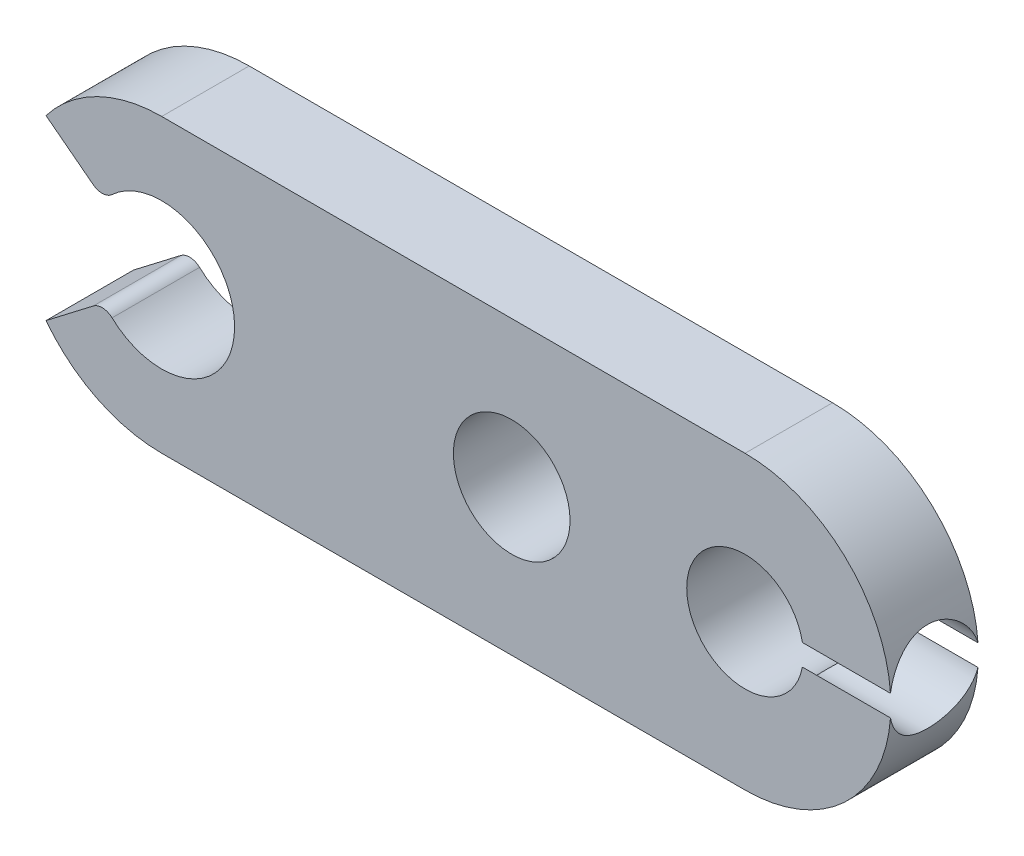
ISO-10303-21;
HEADER;
FILE_DESCRIPTION(('STEP AP214'),'2;1');
FILE_NAME('part.step','',(''),(''),'','','');
FILE_SCHEMA(('AUTOMOTIVE_DESIGN { 1 0 10303 214 1 1 1 1 }'));
ENDSEC;
DATA;
#1=APPLICATION_CONTEXT('core data for automotive mechanical design processes');
#2=APPLICATION_PROTOCOL_DEFINITION('international standard','automotive_design',2000,#1);
#3=PRODUCT_CONTEXT('',#1,'mechanical');
#4=PRODUCT('Part','Part','',(#3));
#5=PRODUCT_RELATED_PRODUCT_CATEGORY('part','',(#4));
#6=PRODUCT_DEFINITION_FORMATION('','',#4);
#7=PRODUCT_DEFINITION_CONTEXT('part definition',#1,'design');
#8=PRODUCT_DEFINITION('design','',#6,#7);
#9=PRODUCT_DEFINITION_SHAPE('','',#8);
#10=(LENGTH_UNIT() NAMED_UNIT(*) SI_UNIT(.MILLI.,.METRE.));
#11=(NAMED_UNIT(*) PLANE_ANGLE_UNIT() SI_UNIT($,.RADIAN.));
#12=(NAMED_UNIT(*) SI_UNIT($,.STERADIAN.) SOLID_ANGLE_UNIT());
#13=UNCERTAINTY_MEASURE_WITH_UNIT(LENGTH_MEASURE(1.E-05),#10,'distance_accuracy_value','');
#14=(GEOMETRIC_REPRESENTATION_CONTEXT(3) GLOBAL_UNCERTAINTY_ASSIGNED_CONTEXT((#13)) GLOBAL_UNIT_ASSIGNED_CONTEXT((#10,
#11,#12)) REPRESENTATION_CONTEXT('',''));
#15=CARTESIAN_POINT('',(0.,0.,0.));
#16=DIRECTION('',(0.,0.,1.));
#17=DIRECTION('',(1.,0.,0.));
#18=AXIS2_PLACEMENT_3D('',#15,#16,#17);
#19=CARTESIAN_POINT('',(0.,0.,3.));
#20=DIRECTION('',(0.,0.,-1.));
#21=DIRECTION('',(-1.,0.,0.));
#22=AXIS2_PLACEMENT_3D('',#19,#20,#21);
#23=CYLINDRICAL_SURFACE('',#22,5.);
#24=CARTESIAN_POINT('',(0.,0.,2.));
#25=DIRECTION('',(0.,0.,-1.));
#26=DIRECTION('',(-1.,0.,0.));
#27=AXIS2_PLACEMENT_3D('',#24,#25,#26);
#28=CIRCLE('',#27,5.);
#29=CARTESIAN_POINT('',(0.,-4.99999999999545,2.));
#30=VERTEX_POINT('',#29);
#31=CARTESIAN_POINT('',(-2.9999999999859,-4.0000000000191,2.));
#32=VERTEX_POINT('',#31);
#33=EDGE_CURVE('E207',#30,#32,#28,.T.);
#34=ORIENTED_EDGE('',*,*,#33,.F.);
#35=DIRECTION('',(0.,0.,-1.));
#36=VECTOR('',#35,1.);
#37=CARTESIAN_POINT('',(0.,-5.,3.));
#38=LINE('',#37,#36);
#39=CARTESIAN_POINT('',(0.,-5.,3.));
#40=VERTEX_POINT('',#39);
#41=EDGE_CURVE('E341',#40,#30,#38,.T.);
#42=ORIENTED_EDGE('',*,*,#41,.F.);
#43=CARTESIAN_POINT('',(0.,0.,3.));
#44=DIRECTION('',(0.,0.,1.));
#45=DIRECTION('',(-1.,0.,0.));
#46=AXIS2_PLACEMENT_3D('',#43,#44,#45);
#47=CIRCLE('',#46,5.);
#48=CARTESIAN_POINT('',(-3.96676670145618,-3.04380714504359,3.));
#49=VERTEX_POINT('',#48);
#50=EDGE_CURVE('E298',#49,#40,#47,.T.);
#51=ORIENTED_EDGE('',*,*,#50,.F.);
#52=DIRECTION('',(0.,0.,-1.));
#53=VECTOR('',#52,1.);
#54=CARTESIAN_POINT('',(-3.96676670145618,-3.04380714504359,3.));
#55=LINE('',#54,#53);
#56=CARTESIAN_POINT('',(-3.96676670145618,-3.04380714504359,0.));
#57=VERTEX_POINT('',#56);
#58=EDGE_CURVE('E344',#49,#57,#55,.T.);
#59=ORIENTED_EDGE('',*,*,#58,.T.);
#60=CARTESIAN_POINT('',(0.,0.,0.));
#61=DIRECTION('',(0.,0.,1.));
#62=DIRECTION('',(-1.,0.,0.));
#63=AXIS2_PLACEMENT_3D('',#60,#61,#62);
#64=CIRCLE('',#63,5.);
#65=CARTESIAN_POINT('',(0.,-5.,0.));
#66=VERTEX_POINT('',#65);
#67=EDGE_CURVE('E320',#57,#66,#64,.T.);
#68=ORIENTED_EDGE('',*,*,#67,.T.);
#69=CARTESIAN_POINT('',(0.,-4.99999999999545,1.));
#70=VERTEX_POINT('',#69);
#71=EDGE_CURVE('E340',#70,#66,#38,.T.);
#72=ORIENTED_EDGE('',*,*,#71,.F.);
#73=CARTESIAN_POINT('',(0.,0.,1.));
#74=DIRECTION('',(0.,0.,-1.));
#75=DIRECTION('',(-1.,0.,0.));
#76=AXIS2_PLACEMENT_3D('',#73,#74,#75);
#77=CIRCLE('',#76,5.);
#78=CARTESIAN_POINT('',(-2.9999999999859,-4.0000000000191,1.));
#79=VERTEX_POINT('',#78);
#80=EDGE_CURVE('E225',#70,#79,#77,.T.);
#81=ORIENTED_EDGE('',*,*,#80,.T.);
#82=DIRECTION('',(0.,0.,-1.));
#83=VECTOR('',#82,1.);
#84=CARTESIAN_POINT('',(-2.9999999999859,-4.0000000000191,2.));
#85=LINE('',#84,#83);
#86=EDGE_CURVE('E223',#32,#79,#85,.T.);
#87=ORIENTED_EDGE('',*,*,#86,.F.);
#88=EDGE_LOOP('',(#34,#42,#51,#59,#68,#72,#81,#87));
#89=FACE_BOUND('',#88,.T.);
#90=ADVANCED_FACE('F41',(#89),#23,.T.);
#91=CARTESIAN_POINT('',(20.,-5.,3.));
#92=DIRECTION('',(0.,1.,0.));
#93=DIRECTION('',(-1.,0.,0.));
#94=AXIS2_PLACEMENT_3D('',#91,#92,#93);
#95=PLANE('',#94);
#96=DIRECTION('',(-1.,0.,0.));
#97=VECTOR('',#96,1.);
#98=CARTESIAN_POINT('',(400010.516616649,-4.99999999999545,2.));
#99=LINE('',#98,#97);
#100=CARTESIAN_POINT('',(19.9999999999818,-4.99999999999545,2.));
#101=VERTEX_POINT('',#100);
#102=EDGE_CURVE('E203',#101,#30,#99,.T.);
#103=ORIENTED_EDGE('',*,*,#102,.F.);
#104=DIRECTION('',(0.,0.,-1.));
#105=VECTOR('',#104,1.);
#106=CARTESIAN_POINT('',(20.,-5.,3.));
#107=LINE('',#106,#105);
#108=CARTESIAN_POINT('',(20.,-5.,3.));
#109=VERTEX_POINT('',#108);
#110=EDGE_CURVE('E337',#109,#101,#107,.T.);
#111=ORIENTED_EDGE('',*,*,#110,.F.);
#112=DIRECTION('',(1.,0.,0.));
#113=VECTOR('',#112,1.);
#114=CARTESIAN_POINT('',(20.,-5.,3.));
#115=LINE('',#114,#113);
#116=EDGE_CURVE('E300',#40,#109,#115,.T.);
#117=ORIENTED_EDGE('',*,*,#116,.F.);
#118=ORIENTED_EDGE('',*,*,#41,.T.);
#119=EDGE_LOOP('',(#103,#111,#117,#118));
#120=FACE_BOUND('',#119,.T.);
#121=ADVANCED_FACE('F425',(#120),#95,.F.);
#122=CARTESIAN_POINT('',(20.,0.,3.));
#123=DIRECTION('',(0.,0.,-1.));
#124=DIRECTION('',(-1.,0.,0.));
#125=AXIS2_PLACEMENT_3D('',#122,#123,#124);
#126=CYLINDRICAL_SURFACE('',#125,5.);
#127=CARTESIAN_POINT('',(19.9999999999999,0.,2.));
#128=DIRECTION('',(0.,0.,-1.));
#129=DIRECTION('',(-1.,0.,0.));
#130=AXIS2_PLACEMENT_3D('',#127,#128,#129);
#131=CIRCLE('',#130,5.00000000000007);
#132=CARTESIAN_POINT('',(23.404072372021,-3.66227952046857,2.));
#133=VERTEX_POINT('',#132);
#134=EDGE_CURVE('E213',#133,#101,#131,.T.);
#135=ORIENTED_EDGE('',*,*,#134,.F.);
#136=DIRECTION('',(0.,0.,-1.));
#137=VECTOR('',#136,1.);
#138=CARTESIAN_POINT('',(23.404072372021,-3.66227952046857,2.));
#139=LINE('',#138,#137);
#140=CARTESIAN_POINT('',(23.404072372021,-3.66227952046857,1.));
#141=VERTEX_POINT('',#140);
#142=EDGE_CURVE('E226',#133,#141,#139,.T.);
#143=ORIENTED_EDGE('',*,*,#142,.T.);
#144=CARTESIAN_POINT('',(19.9999999999999,0.,1.));
#145=DIRECTION('',(0.,0.,-1.));
#146=DIRECTION('',(-1.,0.,0.));
#147=AXIS2_PLACEMENT_3D('',#144,#145,#146);
#148=CIRCLE('',#147,5.00000000000007);
#149=CARTESIAN_POINT('',(20.,-5.,1.));
#150=VERTEX_POINT('',#149);
#151=EDGE_CURVE('E209',#141,#150,#148,.T.);
#152=ORIENTED_EDGE('',*,*,#151,.T.);
#153=CARTESIAN_POINT('',(20.,-5.,0.));
#154=VERTEX_POINT('',#153);
#155=EDGE_CURVE('E336',#150,#154,#107,.T.);
#156=ORIENTED_EDGE('',*,*,#155,.T.);
#157=CARTESIAN_POINT('',(20.,0.,0.));
#158=DIRECTION('',(0.,0.,1.));
#159=DIRECTION('',(-1.,0.,0.));
#160=AXIS2_PLACEMENT_3D('',#157,#158,#159);
#161=CIRCLE('',#160,5.);
#162=CARTESIAN_POINT('',(24.9866658136976,-0.364916514424875,0.));
#163=VERTEX_POINT('',#162);
#164=EDGE_CURVE('E327',#154,#163,#161,.T.);
#165=ORIENTED_EDGE('',*,*,#164,.T.);
#166=CARTESIAN_POINT('',(24.9866658136976,-0.364916514424875,0.));
#167=CARTESIAN_POINT('',(24.9835825094209,-0.407087459470647,0.0102589257328632));
#168=CARTESIAN_POINT('',(24.9799914832528,-0.448766728966271,0.0222835161335183));
#169=CARTESIAN_POINT('',(24.9719075893307,-0.530878539503926,0.0497562045243458));
#170=CARTESIAN_POINT('',(24.9674149785577,-0.571311432024092,0.0652033271118023));
#171=CARTESIAN_POINT('',(24.9527787968857,-0.690163480971913,0.116433234220957));
#172=CARTESIAN_POINT('',(24.9414587060645,-0.766370210096216,0.157162061922017));
#173=CARTESIAN_POINT('',(24.9169189509259,-0.910647962347859,0.250490298007002));
#174=CARTESIAN_POINT('',(24.9037003816804,-0.978723634415758,0.303082873107988));
#175=CARTESIAN_POINT('',(24.8767519710575,-1.10520337968082,0.418780948143433));
#176=CARTESIAN_POINT('',(24.8630219315912,-1.16360365694726,0.481890554820878));
#177=CARTESIAN_POINT('',(24.83622954348,-1.27043059967941,0.618599684623371));
#178=CARTESIAN_POINT('',(24.8231896421701,-1.31859866287736,0.692406079591642));
#179=CARTESIAN_POINT('',(24.7996654616523,-1.40181668200409,0.847458103907504));
#180=CARTESIAN_POINT('',(24.7891808207944,-1.43686849467348,0.928702678275806));
#181=CARTESIAN_POINT('',(24.7722368080486,-1.49217451138823,1.0948928025855));
#182=CARTESIAN_POINT('',(24.7657099512102,-1.51267787997583,1.17974825002846));
#183=CARTESIAN_POINT('',(24.7572457823751,-1.53909440696019,1.35191195587471));
#184=CARTESIAN_POINT('',(24.7553068039853,-1.54501286286999,1.43921931204171));
#185=CARTESIAN_POINT('',(24.7562507215651,-1.54210130532529,1.60973459149127));
#186=CARTESIAN_POINT('',(24.7589270465333,-1.53390314535245,1.6929552647333));
#187=CARTESIAN_POINT('',(24.7683774481442,-1.50426556228149,1.85676025635423));
#188=CARTESIAN_POINT('',(24.775151813276,-1.48282520697216,1.93734438870792));
#189=CARTESIAN_POINT('',(24.7920033559885,-1.42742254234262,2.09372994909098));
#190=CARTESIAN_POINT('',(24.8020816368126,-1.39345604982128,2.16952976944674));
#191=CARTESIAN_POINT('',(24.8244250067065,-1.31400952519945,2.3144804771424));
#192=CARTESIAN_POINT('',(24.8366905885175,-1.26852689784556,2.38362986089972));
#193=CARTESIAN_POINT('',(24.8626891778709,-1.16499660457468,2.51653654117496));
#194=CARTESIAN_POINT('',(24.876462876715,-1.10648695911377,2.57992648886016));
#195=CARTESIAN_POINT('',(24.9035069250958,-0.979703517633687,2.69613711836809));
#196=CARTESIAN_POINT('',(24.9167773404027,-0.911431003049906,2.74895918510936));
#197=CARTESIAN_POINT('',(24.9413860769349,-0.766846121963175,2.84257360399596));
#198=CARTESIAN_POINT('',(24.9527271966569,-0.690545664965429,2.88338344410214));
#199=CARTESIAN_POINT('',(24.9673881795134,-0.571547496128998,2.93470421039402));
#200=CARTESIAN_POINT('',(24.9718875783464,-0.531069559813545,2.950175383051));
#201=CARTESIAN_POINT('',(24.9799830671231,-0.448864447542183,2.97768827337947));
#202=CARTESIAN_POINT('',(24.9835789002845,-0.407136920230079,2.98972901629514));
#203=CARTESIAN_POINT('',(24.9866658136976,-0.364916514424875,3.));
#204=B_SPLINE_CURVE_WITH_KNOTS('',3,(#166,#167,#168,#169,#170,#171,#172,#173,#174,#175,#176,
#177,#178,#179,#180,#181,#182,#183,#184,#185,#186,#187,#188,#189,#190,#191,#192,#193,#194,#195,
#196,#197,#198,#199,#200,#201,#202,#203),.UNSPECIFIED.,.F.,.F.,(4,2,2,2,2,2,2,2,2,2,2,2,2,2,2,2,
2,2,4),(0.,0.13044317055757,0.260849213243291,0.520945334439345,0.780892026228258,
1.04094046217187,1.30693538867901,1.57289264660203,1.83417720753499,2.09536685103203,
2.34516732372902,2.59498538364156,2.84488694790495,3.09484487969436,3.35571855622395,
3.6165580228877,3.87701584742914,4.00757470234654,4.13817061861643),.UNSPECIFIED.);
#205=CARTESIAN_POINT('',(24.9866658136976,-0.364916514424875,3.));
#206=VERTEX_POINT('',#205);
#207=EDGE_CURVE('E238',#163,#206,#204,.T.);
#208=ORIENTED_EDGE('',*,*,#207,.T.);
#209=CARTESIAN_POINT('',(20.,0.,3.));
#210=DIRECTION('',(0.,0.,1.));
#211=DIRECTION('',(-1.,0.,0.));
#212=AXIS2_PLACEMENT_3D('',#209,#210,#211);
#213=CIRCLE('',#212,5.);
#214=EDGE_CURVE('E303',#109,#206,#213,.T.);
#215=ORIENTED_EDGE('',*,*,#214,.F.);
#216=ORIENTED_EDGE('',*,*,#110,.T.);
#217=EDGE_LOOP('',(#135,#143,#152,#156,#165,#208,#215,#216));
#218=FACE_BOUND('',#217,.T.);
#219=ADVANCED_FACE('F248',(#218),#126,.T.);
#220=CARTESIAN_POINT('',(24.9866658136976,0.364916514424875,3.));
#221=VERTEX_POINT('',#220);
#222=CARTESIAN_POINT('',(20.,5.,3.));
#223=VERTEX_POINT('',#222);
#224=EDGE_CURVE('E302',#221,#223,#213,.T.);
#225=ORIENTED_EDGE('',*,*,#224,.F.);
#226=CARTESIAN_POINT('',(24.9866658136976,0.364916514424875,3.));
#227=CARTESIAN_POINT('',(24.9835825094209,0.407087459470647,2.98974107426714));
#228=CARTESIAN_POINT('',(24.9799914832528,0.44876672896627,2.97771648386648));
#229=CARTESIAN_POINT('',(24.9719075893307,0.530878539503926,2.95024379547565));
#230=CARTESIAN_POINT('',(24.9674149785577,0.571311432024092,2.9347966728882));
#231=CARTESIAN_POINT('',(24.9527787968857,0.690163480971913,2.88356676577904));
#232=CARTESIAN_POINT('',(24.9414587060645,0.766370210096216,2.84283793807798));
#233=CARTESIAN_POINT('',(24.9169189509259,0.910647962347859,2.749509701993));
#234=CARTESIAN_POINT('',(24.9037003816804,0.978723634415758,2.69691712689201));
#235=CARTESIAN_POINT('',(24.8767519710575,1.10520337968082,2.58121905185657));
#236=CARTESIAN_POINT('',(24.8630219315912,1.16360365694726,2.51810944517912));
#237=CARTESIAN_POINT('',(24.83622954348,1.27043059967941,2.38140031537663));
#238=CARTESIAN_POINT('',(24.8231896421701,1.31859866287736,2.30759392040836));
#239=CARTESIAN_POINT('',(24.7996654616523,1.40181668200409,2.1525418960925));
#240=CARTESIAN_POINT('',(24.7891808207944,1.43686849467348,2.07129732172419));
#241=CARTESIAN_POINT('',(24.7722368080486,1.49217451138823,1.9051071974145));
#242=CARTESIAN_POINT('',(24.7657099512102,1.51267787997583,1.82025174997154));
#243=CARTESIAN_POINT('',(24.7572457823751,1.53909440696019,1.64808804412529));
#244=CARTESIAN_POINT('',(24.7553068039853,1.54501286286999,1.56078068795829));
#245=CARTESIAN_POINT('',(24.7562507215651,1.54210130532529,1.39026540850873));
#246=CARTESIAN_POINT('',(24.7589270465333,1.53390314535245,1.3070447352667));
#247=CARTESIAN_POINT('',(24.7683774481442,1.50426556228149,1.14323974364577));
#248=CARTESIAN_POINT('',(24.775151813276,1.48282520697216,1.06265561129208));
#249=CARTESIAN_POINT('',(24.7920033559885,1.42742254234262,0.906270050909023));
#250=CARTESIAN_POINT('',(24.8020816368126,1.39345604982127,0.830470230553263));
#251=CARTESIAN_POINT('',(24.8244250067065,1.31400952519945,0.6855195228576));
#252=CARTESIAN_POINT('',(24.8366905885175,1.26852689784556,0.616370139100277));
#253=CARTESIAN_POINT('',(24.8626891778709,1.16499660457468,0.483463458825042));
#254=CARTESIAN_POINT('',(24.876462876715,1.10648695911377,0.420073511139844));
#255=CARTESIAN_POINT('',(24.9035069250958,0.979703517633687,0.30386288163191));
#256=CARTESIAN_POINT('',(24.9167773404027,0.911431003049906,0.251040814890635));
#257=CARTESIAN_POINT('',(24.9413860769349,0.766846121963175,0.157426396004036));
#258=CARTESIAN_POINT('',(24.9527271966569,0.690545664965429,0.116616555897859));
#259=CARTESIAN_POINT('',(24.9673881795134,0.571547496128999,0.0652957896059853));
#260=CARTESIAN_POINT('',(24.9718875783464,0.531069559813545,0.0498246169490044));
#261=CARTESIAN_POINT('',(24.9799830671231,0.448864447542184,0.0223117266205306));
#262=CARTESIAN_POINT('',(24.9835789002845,0.407136920230079,0.0102709837048634));
#263=CARTESIAN_POINT('',(24.9866658136976,0.364916514424875,0.));
#264=B_SPLINE_CURVE_WITH_KNOTS('',3,(#226,#227,#228,#229,#230,#231,#232,#233,#234,#235,#236,
#237,#238,#239,#240,#241,#242,#243,#244,#245,#246,#247,#248,#249,#250,#251,#252,#253,#254,#255,
#256,#257,#258,#259,#260,#261,#262,#263),.UNSPECIFIED.,.F.,.F.,(4,2,2,2,2,2,2,2,2,2,2,2,2,2,2,2,
2,2,4),(0.,0.13044317055757,0.260849213243291,0.520945334439345,0.780892026228258,
1.04094046217187,1.30693538867901,1.57289264660203,1.83417720753499,2.09536685103203,
2.34516732372902,2.59498538364156,2.84488694790495,3.09484487969436,3.35571855622395,
3.6165580228877,3.87701584742914,4.00757470234654,4.13817061861643),.UNSPECIFIED.);
#265=CARTESIAN_POINT('',(24.9866658136976,0.364916514424875,0.));
#266=VERTEX_POINT('',#265);
#267=EDGE_CURVE('E269',#221,#266,#264,.T.);
#268=ORIENTED_EDGE('',*,*,#267,.T.);
#269=CARTESIAN_POINT('',(20.,5.,0.));
#270=VERTEX_POINT('',#269);
#271=EDGE_CURVE('E326',#266,#270,#161,.T.);
#272=ORIENTED_EDGE('',*,*,#271,.T.);
#273=DIRECTION('',(0.,0.,-1.));
#274=VECTOR('',#273,1.);
#275=CARTESIAN_POINT('',(20.,5.,3.));
#276=LINE('',#275,#274);
#277=EDGE_CURVE('E333',#223,#270,#276,.T.);
#278=ORIENTED_EDGE('',*,*,#277,.F.);
#279=EDGE_LOOP('',(#225,#268,#272,#278));
#280=FACE_BOUND('',#279,.T.);
#281=ADVANCED_FACE('F386',(#280),#126,.T.);
#282=CARTESIAN_POINT('',(0.,0.,3.));
#283=DIRECTION('',(0.,0.,-1.));
#284=DIRECTION('',(-1.,0.,0.));
#285=AXIS2_PLACEMENT_3D('',#282,#283,#284);
#286=CYLINDRICAL_SURFACE('',#285,5.);
#287=CARTESIAN_POINT('',(0.,0.,0.));
#288=DIRECTION('',(0.,0.,1.));
#289=DIRECTION('',(-1.,0.,0.));
#290=AXIS2_PLACEMENT_3D('',#287,#288,#289);
#291=CIRCLE('',#290,5.);
#292=CARTESIAN_POINT('',(0.,5.,0.));
#293=VERTEX_POINT('',#292);
#294=CARTESIAN_POINT('',(-3.96676670145618,3.04380714504359,0.));
#295=VERTEX_POINT('',#294);
#296=EDGE_CURVE('E309',#293,#295,#291,.T.);
#297=ORIENTED_EDGE('',*,*,#296,.T.);
#298=DIRECTION('',(0.,0.,-1.));
#299=VECTOR('',#298,1.);
#300=CARTESIAN_POINT('',(-3.96676670145618,3.04380714504359,3.));
#301=LINE('',#300,#299);
#302=CARTESIAN_POINT('',(-3.96676670145618,3.04380714504359,3.));
#303=VERTEX_POINT('',#302);
#304=EDGE_CURVE('E347',#303,#295,#301,.T.);
#305=ORIENTED_EDGE('',*,*,#304,.F.);
#306=CARTESIAN_POINT('',(0.,0.,3.));
#307=DIRECTION('',(0.,0.,1.));
#308=DIRECTION('',(-1.,0.,0.));
#309=AXIS2_PLACEMENT_3D('',#306,#307,#308);
#310=CIRCLE('',#309,5.);
#311=CARTESIAN_POINT('',(0.,5.,3.));
#312=VERTEX_POINT('',#311);
#313=EDGE_CURVE('E286',#312,#303,#310,.T.);
#314=ORIENTED_EDGE('',*,*,#313,.F.);
#315=DIRECTION('',(0.,0.,-1.));
#316=VECTOR('',#315,1.);
#317=CARTESIAN_POINT('',(0.,5.,3.));
#318=LINE('',#317,#316);
#319=EDGE_CURVE('E308',#312,#293,#318,.T.);
#320=ORIENTED_EDGE('',*,*,#319,.T.);
#321=EDGE_LOOP('',(#297,#305,#314,#320));
#322=FACE_BOUND('',#321,.T.);
#323=ADVANCED_FACE('F395',(#322),#286,.T.);
#324=CARTESIAN_POINT('',(-3.96676670145618,3.04380714504359,3.));
#325=DIRECTION('',(0.608761429008719,0.793353340291236,0.));
#326=DIRECTION('',(-0.793353340291236,0.60876142900872,0.));
#327=AXIS2_PLACEMENT_3D('',#324,#325,#326);
#328=PLANE('',#327);
#329=DIRECTION('',(0.793353340291236,-0.60876142900872,0.));
#330=VECTOR('',#329,1.);
#331=CARTESIAN_POINT('',(-3.96676670145618,3.04380714504359,0.));
#332=LINE('',#331,#330);
#333=CARTESIAN_POINT('',(-2.34677082867577,1.80074059144465,0.));
#334=VERTEX_POINT('',#333);
#335=EDGE_CURVE('E312',#295,#334,#332,.T.);
#336=ORIENTED_EDGE('',*,*,#335,.T.);
#337=DIRECTION('',(0.,0.,-1.));
#338=VECTOR('',#337,1.);
#339=CARTESIAN_POINT('',(-2.34677082867577,1.80074059144465,3.));
#340=LINE('',#339,#338);
#341=CARTESIAN_POINT('',(-2.34677082867577,1.80074059144465,3.));
#342=VERTEX_POINT('',#341);
#343=EDGE_CURVE('E359',#334,#342,#340,.F.);
#344=ORIENTED_EDGE('',*,*,#343,.T.);
#345=DIRECTION('',(0.793353340291236,-0.60876142900872,0.));
#346=VECTOR('',#345,1.);
#347=CARTESIAN_POINT('',(-3.96676670145618,3.04380714504359,3.));
#348=LINE('',#347,#346);
#349=EDGE_CURVE('E289',#303,#342,#348,.T.);
#350=ORIENTED_EDGE('',*,*,#349,.F.);
#351=ORIENTED_EDGE('',*,*,#304,.T.);
#352=EDGE_LOOP('',(#336,#344,#350,#351));
#353=FACE_BOUND('',#352,.T.);
#354=ADVANCED_FACE('F398',(#353),#328,.F.);
#355=CARTESIAN_POINT('',(0.,0.,3.));
#356=DIRECTION('',(0.,0.,-1.));
#357=DIRECTION('',(-1.,0.,0.));
#358=AXIS2_PLACEMENT_3D('',#355,#356,#357);
#359=CYLINDRICAL_SURFACE('',#358,2.5);
#360=CARTESIAN_POINT('',(0.,0.,3.));
#361=DIRECTION('',(0.,0.,-1.));
#362=DIRECTION('',(-1.,0.,0.));
#363=AXIS2_PLACEMENT_3D('',#360,#361,#362);
#364=CIRCLE('',#363,2.5);
#365=CARTESIAN_POINT('',(-1.70199176180951,1.83118105132523,3.));
#366=VERTEX_POINT('',#365);
#367=CARTESIAN_POINT('',(-1.70199176180951,-1.83118105132523,3.));
#368=VERTEX_POINT('',#367);
#369=EDGE_CURVE('E293',#366,#368,#364,.T.);
#370=ORIENTED_EDGE('',*,*,#369,.F.);
#371=DIRECTION('',(0.,0.,-1.));
#372=VECTOR('',#371,1.);
#373=CARTESIAN_POINT('',(-1.70199176180951,1.83118105132523,3.));
#374=LINE('',#373,#372);
#375=CARTESIAN_POINT('',(-1.70199176180951,1.83118105132523,0.));
#376=VERTEX_POINT('',#375);
#377=EDGE_CURVE('E352',#366,#376,#374,.T.);
#378=ORIENTED_EDGE('',*,*,#377,.T.);
#379=CARTESIAN_POINT('',(0.,0.,0.));
#380=DIRECTION('',(0.,0.,-1.));
#381=DIRECTION('',(-1.,0.,0.));
#382=AXIS2_PLACEMENT_3D('',#379,#380,#381);
#383=CIRCLE('',#382,2.5);
#384=CARTESIAN_POINT('',(-1.70199176180951,-1.83118105132523,0.));
#385=VERTEX_POINT('',#384);
#386=EDGE_CURVE('E315',#376,#385,#383,.T.);
#387=ORIENTED_EDGE('',*,*,#386,.T.);
#388=DIRECTION('',(0.,0.,-1.));
#389=VECTOR('',#388,1.);
#390=CARTESIAN_POINT('',(-1.70199176180951,-1.83118105132523,3.));
#391=LINE('',#390,#389);
#392=EDGE_CURVE('E350',#385,#368,#391,.F.);
#393=ORIENTED_EDGE('',*,*,#392,.T.);
#394=EDGE_LOOP('',(#370,#378,#387,#393));
#395=FACE_BOUND('',#394,.T.);
#396=ADVANCED_FACE('F406',(#395),#359,.F.);
#397=CARTESIAN_POINT('',(-1.98338335072809,-1.52190357252179,3.));
#398=DIRECTION('',(0.608761429008719,-0.793353340291236,0.));
#399=DIRECTION('',(0.793353340291236,0.60876142900872,0.));
#400=AXIS2_PLACEMENT_3D('',#397,#398,#399);
#401=PLANE('',#400);
#402=DIRECTION('',(-0.793353340291236,-0.60876142900872,0.));
#403=VECTOR('',#402,1.);
#404=CARTESIAN_POINT('',(-1.98338335072809,-1.52190357252179,3.));
#405=LINE('',#404,#403);
#406=CARTESIAN_POINT('',(-2.34677082867577,-1.80074059144465,3.));
#407=VERTEX_POINT('',#406);
#408=EDGE_CURVE('E296',#407,#49,#405,.T.);
#409=ORIENTED_EDGE('',*,*,#408,.F.);
#410=DIRECTION('',(0.,0.,-1.));
#411=VECTOR('',#410,1.);
#412=CARTESIAN_POINT('',(-2.34677082867577,-1.80074059144465,3.));
#413=LINE('',#412,#411);
#414=CARTESIAN_POINT('',(-2.34677082867577,-1.80074059144465,0.));
#415=VERTEX_POINT('',#414);
#416=EDGE_CURVE('E365',#407,#415,#413,.T.);
#417=ORIENTED_EDGE('',*,*,#416,.T.);
#418=DIRECTION('',(-0.793353340291236,-0.60876142900872,0.));
#419=VECTOR('',#418,1.);
#420=CARTESIAN_POINT('',(-1.98338335072809,-1.52190357252179,0.));
#421=LINE('',#420,#419);
#422=EDGE_CURVE('E318',#415,#57,#421,.T.);
#423=ORIENTED_EDGE('',*,*,#422,.T.);
#424=ORIENTED_EDGE('',*,*,#58,.F.);
#425=EDGE_LOOP('',(#409,#417,#423,#424));
#426=FACE_BOUND('',#425,.T.);
#427=ADVANCED_FACE('F414',(#426),#401,.F.);
#428=ORIENTED_EDGE('',*,*,#155,.F.);
#429=DIRECTION('',(-1.,0.,0.));
#430=VECTOR('',#429,1.);
#431=CARTESIAN_POINT('',(400010.516616649,-4.99999999999545,1.));
#432=LINE('',#431,#430);
#433=EDGE_CURVE('E62',#150,#70,#432,.T.);
#434=ORIENTED_EDGE('',*,*,#433,.T.);
#435=ORIENTED_EDGE('',*,*,#71,.T.);
#436=DIRECTION('',(1.,0.,0.));
#437=VECTOR('',#436,1.);
#438=CARTESIAN_POINT('',(20.,-5.,0.));
#439=LINE('',#438,#437);
#440=EDGE_CURVE('E323',#66,#154,#439,.T.);
#441=ORIENTED_EDGE('',*,*,#440,.T.);
#442=EDGE_LOOP('',(#428,#434,#435,#441));
#443=FACE_BOUND('',#442,.T.);
#444=ADVANCED_FACE('F439',(#443),#95,.F.);
#445=CARTESIAN_POINT('',(0.,5.,3.));
#446=DIRECTION('',(0.,-1.,0.));
#447=DIRECTION('',(1.,0.,0.));
#448=AXIS2_PLACEMENT_3D('',#445,#446,#447);
#449=PLANE('',#448);
#450=DIRECTION('',(-1.,0.,0.));
#451=VECTOR('',#450,1.);
#452=CARTESIAN_POINT('',(0.,5.,0.));
#453=LINE('',#452,#451);
#454=EDGE_CURVE('E290',#270,#293,#453,.T.);
#455=ORIENTED_EDGE('',*,*,#454,.T.);
#456=ORIENTED_EDGE('',*,*,#319,.F.);
#457=DIRECTION('',(-1.,0.,0.));
#458=VECTOR('',#457,1.);
#459=CARTESIAN_POINT('',(0.,5.,3.));
#460=LINE('',#459,#458);
#461=EDGE_CURVE('E306',#223,#312,#460,.T.);
#462=ORIENTED_EDGE('',*,*,#461,.F.);
#463=ORIENTED_EDGE('',*,*,#277,.T.);
#464=EDGE_LOOP('',(#455,#456,#462,#463));
#465=FACE_BOUND('',#464,.T.);
#466=ADVANCED_FACE('F390',(#465),#449,.F.);
#467=CARTESIAN_POINT('',(0.,0.,3.));
#468=DIRECTION('',(0.,0.,-1.));
#469=DIRECTION('',(-1.,0.,0.));
#470=AXIS2_PLACEMENT_3D('',#467,#468,#469);
#471=PLANE('',#470);
#472=CARTESIAN_POINT('',(12.,0.,3.));
#473=DIRECTION('',(0.,0.,1.));
#474=DIRECTION('',(1.,0.,0.));
#475=AXIS2_PLACEMENT_3D('',#472,#473,#474);
#476=CIRCLE('',#475,2.);
#477=CARTESIAN_POINT('',(14.,0.,3.));
#478=VERTEX_POINT('',#477);
#479=EDGE_CURVE('E276',#478,#478,#476,.T.);
#480=ORIENTED_EDGE('',*,*,#479,.F.);
#481=EDGE_LOOP('',(#480));
#482=FACE_BOUND('',#481,.T.);
#483=CARTESIAN_POINT('',(20.,0.,3.));
#484=DIRECTION('',(0.,0.,1.));
#485=DIRECTION('',(1.,0.,0.));
#486=AXIS2_PLACEMENT_3D('',#483,#484,#485);
#487=CIRCLE('',#486,2.);
#488=CARTESIAN_POINT('',(21.9664272011697,0.364916514424875,3.));
#489=VERTEX_POINT('',#488);
#490=CARTESIAN_POINT('',(21.9664272011697,-0.364916514424875,3.));
#491=VERTEX_POINT('',#490);
#492=EDGE_CURVE('E280',#489,#491,#487,.T.);
#493=ORIENTED_EDGE('',*,*,#492,.F.);
#494=DIRECTION('',(1.,0.,0.));
#495=VECTOR('',#494,1.);
#496=CARTESIAN_POINT('',(20.,0.364916514424875,3.));
#497=LINE('',#496,#495);
#498=EDGE_CURVE('E70',#489,#221,#497,.T.);
#499=ORIENTED_EDGE('',*,*,#498,.T.);
#500=ORIENTED_EDGE('',*,*,#224,.T.);
#501=ORIENTED_EDGE('',*,*,#461,.T.);
#502=ORIENTED_EDGE('',*,*,#313,.T.);
#503=ORIENTED_EDGE('',*,*,#349,.T.);
#504=CARTESIAN_POINT('',(-2.04239011417141,2.19741726159027,3.));
#505=DIRECTION('',(0.,0.,-1.));
#506=DIRECTION('',(-1.,0.,0.));
#507=AXIS2_PLACEMENT_3D('',#504,#505,#506);
#508=CIRCLE('',#507,0.5);
#509=EDGE_CURVE('E363',#342,#366,#508,.F.);
#510=ORIENTED_EDGE('',*,*,#509,.T.);
#511=ORIENTED_EDGE('',*,*,#369,.T.);
#512=CARTESIAN_POINT('',(-2.04239011417141,-2.19741726159027,3.));
#513=DIRECTION('',(0.,0.,-1.));
#514=DIRECTION('',(-1.,0.,0.));
#515=AXIS2_PLACEMENT_3D('',#512,#513,#514);
#516=CIRCLE('',#515,0.5);
#517=EDGE_CURVE('E361',#368,#407,#516,.F.);
#518=ORIENTED_EDGE('',*,*,#517,.T.);
#519=ORIENTED_EDGE('',*,*,#408,.T.);
#520=ORIENTED_EDGE('',*,*,#50,.T.);
#521=ORIENTED_EDGE('',*,*,#116,.T.);
#522=ORIENTED_EDGE('',*,*,#214,.T.);
#523=DIRECTION('',(1.,0.,0.));
#524=VECTOR('',#523,1.);
#525=CARTESIAN_POINT('',(20.,-0.364916514424875,3.));
#526=LINE('',#525,#524);
#527=EDGE_CURVE('E235',#206,#491,#526,.F.);
#528=ORIENTED_EDGE('',*,*,#527,.T.);
#529=EDGE_LOOP('',(#493,#499,#500,#501,#502,#503,#510,#511,#518,#519,#520,#521,#522,#528));
#530=FACE_BOUND('',#529,.T.);
#531=ADVANCED_FACE('F383',(#482,#530),#471,.F.);
#532=CARTESIAN_POINT('',(0.,0.,0.));
#533=DIRECTION('',(0.,0.,-1.));
#534=DIRECTION('',(-1.,0.,0.));
#535=AXIS2_PLACEMENT_3D('',#532,#533,#534);
#536=PLANE('',#535);
#537=DIRECTION('',(1.,0.,0.));
#538=VECTOR('',#537,1.);
#539=CARTESIAN_POINT('',(20.,0.364916514424875,0.));
#540=LINE('',#539,#538);
#541=CARTESIAN_POINT('',(21.9664272011697,0.364916514424875,0.));
#542=VERTEX_POINT('',#541);
#543=EDGE_CURVE('E246',#542,#266,#540,.T.);
#544=ORIENTED_EDGE('',*,*,#543,.F.);
#545=CARTESIAN_POINT('',(20.,0.,0.));
#546=DIRECTION('',(0.,0.,-1.));
#547=DIRECTION('',(-1.,0.,0.));
#548=AXIS2_PLACEMENT_3D('',#545,#546,#547);
#549=CIRCLE('',#548,2.);
#550=CARTESIAN_POINT('',(21.9664272011697,-0.364916514424875,0.));
#551=VERTEX_POINT('',#550);
#552=EDGE_CURVE('E285',#551,#542,#549,.T.);
#553=ORIENTED_EDGE('',*,*,#552,.F.);
#554=DIRECTION('',(1.,0.,0.));
#555=VECTOR('',#554,1.);
#556=CARTESIAN_POINT('',(20.,-0.364916514424875,0.));
#557=LINE('',#556,#555);
#558=EDGE_CURVE('E233',#163,#551,#557,.F.);
#559=ORIENTED_EDGE('',*,*,#558,.F.);
#560=ORIENTED_EDGE('',*,*,#164,.F.);
#561=ORIENTED_EDGE('',*,*,#440,.F.);
#562=ORIENTED_EDGE('',*,*,#67,.F.);
#563=ORIENTED_EDGE('',*,*,#422,.F.);
#564=CARTESIAN_POINT('',(-2.04239011417141,-2.19741726159027,0.));
#565=DIRECTION('',(0.,0.,-1.));
#566=DIRECTION('',(-1.,0.,0.));
#567=AXIS2_PLACEMENT_3D('',#564,#565,#566);
#568=CIRCLE('',#567,0.5);
#569=EDGE_CURVE('E355',#415,#385,#568,.T.);
#570=ORIENTED_EDGE('',*,*,#569,.T.);
#571=ORIENTED_EDGE('',*,*,#386,.F.);
#572=CARTESIAN_POINT('',(-2.04239011417141,2.19741726159027,0.));
#573=DIRECTION('',(0.,0.,-1.));
#574=DIRECTION('',(-1.,0.,0.));
#575=AXIS2_PLACEMENT_3D('',#572,#573,#574);
#576=CIRCLE('',#575,0.5);
#577=EDGE_CURVE('E357',#376,#334,#576,.T.);
#578=ORIENTED_EDGE('',*,*,#577,.T.);
#579=ORIENTED_EDGE('',*,*,#335,.F.);
#580=ORIENTED_EDGE('',*,*,#296,.F.);
#581=ORIENTED_EDGE('',*,*,#454,.F.);
#582=ORIENTED_EDGE('',*,*,#271,.F.);
#583=EDGE_LOOP('',(#544,#553,#559,#560,#561,#562,#563,#570,#571,#578,#579,#580,#581,#582));
#584=FACE_BOUND('',#583,.T.);
#585=CARTESIAN_POINT('',(12.,0.,0.));
#586=DIRECTION('',(0.,0.,1.));
#587=DIRECTION('',(1.,0.,0.));
#588=AXIS2_PLACEMENT_3D('',#585,#586,#587);
#589=CIRCLE('',#588,2.);
#590=CARTESIAN_POINT('',(14.,0.,0.));
#591=VERTEX_POINT('',#590);
#592=EDGE_CURVE('E277',#591,#591,#589,.T.);
#593=ORIENTED_EDGE('',*,*,#592,.T.);
#594=EDGE_LOOP('',(#593));
#595=FACE_BOUND('',#594,.T.);
#596=ADVANCED_FACE('F376',(#584,#595),#536,.T.);
#597=CARTESIAN_POINT('',(-2.04239011417141,2.19741726159027,3.));
#598=DIRECTION('',(0.,0.,-1.));
#599=DIRECTION('',(-1.,0.,0.));
#600=AXIS2_PLACEMENT_3D('',#597,#598,#599);
#601=CYLINDRICAL_SURFACE('',#600,0.5);
#602=ORIENTED_EDGE('',*,*,#509,.F.);
#603=ORIENTED_EDGE('',*,*,#343,.F.);
#604=ORIENTED_EDGE('',*,*,#577,.F.);
#605=ORIENTED_EDGE('',*,*,#377,.F.);
#606=EDGE_LOOP('',(#602,#603,#604,#605));
#607=FACE_BOUND('',#606,.T.);
#608=ADVANCED_FACE('F401',(#607),#601,.T.);
#609=CARTESIAN_POINT('',(-2.04239011417141,-2.19741726159027,3.));
#610=DIRECTION('',(0.,0.,-1.));
#611=DIRECTION('',(-1.,0.,0.));
#612=AXIS2_PLACEMENT_3D('',#609,#610,#611);
#613=CYLINDRICAL_SURFACE('',#612,0.5);
#614=ORIENTED_EDGE('',*,*,#517,.F.);
#615=ORIENTED_EDGE('',*,*,#392,.F.);
#616=ORIENTED_EDGE('',*,*,#569,.F.);
#617=ORIENTED_EDGE('',*,*,#416,.F.);
#618=EDGE_LOOP('',(#614,#615,#616,#617));
#619=FACE_BOUND('',#618,.T.);
#620=ADVANCED_FACE('F43',(#619),#613,.T.);
#621=CARTESIAN_POINT('',(20.,0.,-7.));
#622=DIRECTION('',(0.,0.,1.));
#623=DIRECTION('',(1.,0.,0.));
#624=AXIS2_PLACEMENT_3D('',#621,#622,#623);
#625=CYLINDRICAL_SURFACE('',#624,2.);
#626=ORIENTED_EDGE('',*,*,#552,.T.);
#627=CARTESIAN_POINT('',(21.9664272011697,0.364916514424875,0.));
#628=CARTESIAN_POINT('',(21.9587883264413,0.406107065267904,0.0100177488154413));
#629=CARTESIAN_POINT('',(21.9499241131496,0.446629819331682,0.0216763903570576));
#630=CARTESIAN_POINT('',(21.9300088230575,0.526057398189989,0.0480444703619504));
#631=CARTESIAN_POINT('',(21.9189605915951,0.56496424920748,0.0627499406046313));
#632=CARTESIAN_POINT('',(21.8831265887478,0.678278692118969,0.110832200877119));
#633=CARTESIAN_POINT('',(21.8554976724103,0.750064959171066,0.148372309078146));
#634=CARTESIAN_POINT('',(21.7950898502631,0.884930667736566,0.232573375905148));
#635=CARTESIAN_POINT('',(21.762337133269,0.948051477679748,0.279188232557576));
#636=CARTESIAN_POINT('',(21.6937015112114,1.06584944422027,0.380542684088892));
#637=CARTESIAN_POINT('',(21.657807993335,1.12049609593131,0.435310301464739));
#638=CARTESIAN_POINT('',(21.5793729492681,1.22913389007068,0.561676766528488));
#639=CARTESIAN_POINT('',(21.5367086128833,1.2815402566019,0.634562440865997));
#640=CARTESIAN_POINT('',(21.4549624209587,1.37362537234871,0.789762533662742));
#641=CARTESIAN_POINT('',(21.4158740595265,1.41332757731512,0.872059190606243));
#642=CARTESIAN_POINT('',(21.359970665784,1.46676844202156,1.01491909152389));
#643=CARTESIAN_POINT('',(21.3401890014049,1.48471473131142,1.07273174032052));
#644=CARTESIAN_POINT('',(21.3071299117916,1.51390204432257,1.19177268689453));
#645=CARTESIAN_POINT('',(21.2938379642155,1.52515805159372,1.25299301369019));
#646=CARTESIAN_POINT('',(21.2758440521867,1.54025132027787,1.37833124544106));
#647=CARTESIAN_POINT('',(21.2712340369204,1.54400919450612,1.44247287787045));
#648=CARTESIAN_POINT('',(21.2718972401252,1.54346279851349,1.57067787129179));
#649=CARTESIAN_POINT('',(21.277171310981,1.53915783296864,1.63474122505639));
#650=CARTESIAN_POINT('',(21.2952466232585,1.52395694053418,1.75261135429367));
#651=CARTESIAN_POINT('',(21.3070300763054,1.51394736828054,1.80670277947209));
#652=CARTESIAN_POINT('',(21.3357341973442,1.48868431011668,1.9122264655418));
#653=CARTESIAN_POINT('',(21.3526599708548,1.47342561064437,1.96365602395259));
#654=CARTESIAN_POINT('',(21.4024264766312,1.42653501140724,2.09659130925614));
#655=CARTESIAN_POINT('',(21.4383839822327,1.39075185952925,2.17546109430602));
#656=CARTESIAN_POINT('',(21.5143117344765,1.3076899390968,2.32489494487935));
#657=CARTESIAN_POINT('',(21.5542940621062,1.26037591655357,2.39543253480296));
#658=CARTESIAN_POINT('',(21.6355869981853,1.15305818015247,2.53018417621448));
#659=CARTESIAN_POINT('',(21.6768961762853,1.0926751980493,2.59409872600945));
#660=CARTESIAN_POINT('',(21.755757848189,0.960830684242825,2.71149664224742));
#661=CARTESIAN_POINT('',(21.7933246158961,0.889414122940207,2.76502044479176));
#662=CARTESIAN_POINT('',(21.8572421606741,0.745663855458487,2.85400864633851));
#663=CARTESIAN_POINT('',(21.8844114747653,0.67459873904644,2.89090335913902));
#664=CARTESIAN_POINT('',(21.9196657848433,0.562529261302409,2.9381902166413));
#665=CARTESIAN_POINT('',(21.9305358359912,0.52408084901291,2.95265520501132));
#666=CARTESIAN_POINT('',(21.9501466530264,0.445611593497059,2.97861633220669));
#667=CARTESIAN_POINT('',(21.9588845539245,0.405588717542319,2.99010847762917));
#668=CARTESIAN_POINT('',(21.9664272011697,0.364916514424875,3.));
#669=B_SPLINE_CURVE_WITH_KNOTS('',3,(#627,#628,#629,#630,#631,#632,#633,#634,#635,#636,#637,
#638,#639,#640,#641,#642,#643,#644,#645,#646,#647,#648,#649,#650,#651,#652,#653,#654,#655,#656,
#657,#658,#659,#660,#661,#662,#663,#664,#665,#666,#667,#668),.UNSPECIFIED.,.F.,.F.,(4,2,2,2,2,2,
2,2,2,2,2,2,2,2,2,2,2,2,2,2,4),(0.,0.129101286494827,0.258035475374381,0.513470253998129,
0.767639717253799,1.0227038894613,1.31970137090995,1.61614729755723,1.8065957280898,
1.99661600742213,2.18863768962032,2.38067593216555,2.5488291751373,2.71714991656343,
2.9969329388767,3.27758233194512,3.56784838155785,3.85696114905458,4.10935303536386,
4.23666518576158,4.36414747604786),.UNSPECIFIED.);
#670=EDGE_CURVE('E11',#542,#489,#669,.T.);
#671=ORIENTED_EDGE('',*,*,#670,.T.);
#672=ORIENTED_EDGE('',*,*,#492,.T.);
#673=CARTESIAN_POINT('',(21.9664272011697,-0.364916514424875,3.));
#674=CARTESIAN_POINT('',(21.9587883264413,-0.406107065267904,2.98998225118456));
#675=CARTESIAN_POINT('',(21.9499241131496,-0.446629819331682,2.97832360964294));
#676=CARTESIAN_POINT('',(21.9300088230575,-0.526057398189989,2.95195552963805));
#677=CARTESIAN_POINT('',(21.9189605915951,-0.56496424920748,2.93725005939537));
#678=CARTESIAN_POINT('',(21.8831265887478,-0.678278692118969,2.88916779912288));
#679=CARTESIAN_POINT('',(21.8554976724103,-0.750064959171066,2.85162769092185));
#680=CARTESIAN_POINT('',(21.7950898502631,-0.884930667736566,2.76742662409485));
#681=CARTESIAN_POINT('',(21.762337133269,-0.948051477679748,2.72081176744242));
#682=CARTESIAN_POINT('',(21.6937015112114,-1.06584944422027,2.61945731591111));
#683=CARTESIAN_POINT('',(21.657807993335,-1.12049609593131,2.56468969853526));
#684=CARTESIAN_POINT('',(21.5793729492681,-1.22913389007068,2.43832323347151));
#685=CARTESIAN_POINT('',(21.5367086128833,-1.2815402566019,2.365437559134));
#686=CARTESIAN_POINT('',(21.4549624209587,-1.37362537234871,2.21023746633726));
#687=CARTESIAN_POINT('',(21.4158740595265,-1.41332757731512,2.12794080939376));
#688=CARTESIAN_POINT('',(21.359970665784,-1.46676844202156,1.98508090847611));
#689=CARTESIAN_POINT('',(21.3401890014049,-1.48471473131142,1.92726825967948));
#690=CARTESIAN_POINT('',(21.3071299117916,-1.51390204432257,1.80822731310547));
#691=CARTESIAN_POINT('',(21.2938379642155,-1.52515805159372,1.74700698630981));
#692=CARTESIAN_POINT('',(21.2758440521867,-1.54025132027787,1.62166875455895));
#693=CARTESIAN_POINT('',(21.2712340369204,-1.54400919450612,1.55752712212956));
#694=CARTESIAN_POINT('',(21.2718972401252,-1.54346279851349,1.42932212870821));
#695=CARTESIAN_POINT('',(21.277171310981,-1.53915783296864,1.36525877494361));
#696=CARTESIAN_POINT('',(21.2952466232585,-1.52395694053418,1.24738864570633));
#697=CARTESIAN_POINT('',(21.3070300763054,-1.51394736828054,1.19329722052791));
#698=CARTESIAN_POINT('',(21.3357341973442,-1.48868431011668,1.08777353445821));
#699=CARTESIAN_POINT('',(21.3526599708548,-1.47342561064437,1.03634397604741));
#700=CARTESIAN_POINT('',(21.4024264766312,-1.42653501140725,0.903408690743866));
#701=CARTESIAN_POINT('',(21.4383839822327,-1.39075185952926,0.824538905693986));
#702=CARTESIAN_POINT('',(21.5143117344765,-1.3076899390968,0.675105055120656));
#703=CARTESIAN_POINT('',(21.5542940621062,-1.26037591655357,0.604567465197046));
#704=CARTESIAN_POINT('',(21.6355869981853,-1.15305818015247,0.469815823785527));
#705=CARTESIAN_POINT('',(21.6768961762853,-1.0926751980493,0.405901273990556));
#706=CARTESIAN_POINT('',(21.755757848189,-0.960830684242829,0.288503357752586));
#707=CARTESIAN_POINT('',(21.7933246158961,-0.889414122940213,0.234979555208246));
#708=CARTESIAN_POINT('',(21.8572421606741,-0.745663855458494,0.145991353661494));
#709=CARTESIAN_POINT('',(21.8844114747653,-0.674598739046445,0.109096640860981));
#710=CARTESIAN_POINT('',(21.9196657848433,-0.562529261302412,0.0618097833587065));
#711=CARTESIAN_POINT('',(21.9305358359912,-0.524080849012913,0.0473447949886778));
#712=CARTESIAN_POINT('',(21.9501466530264,-0.44561159349706,0.0213836677933094));
#713=CARTESIAN_POINT('',(21.9588845539245,-0.40558871754232,0.00989152237082805));
#714=CARTESIAN_POINT('',(21.9664272011697,-0.364916514424875,0.));
#715=B_SPLINE_CURVE_WITH_KNOTS('',3,(#673,#674,#675,#676,#677,#678,#679,#680,#681,#682,#683,
#684,#685,#686,#687,#688,#689,#690,#691,#692,#693,#694,#695,#696,#697,#698,#699,#700,#701,#702,
#703,#704,#705,#706,#707,#708,#709,#710,#711,#712,#713,#714),.UNSPECIFIED.,.F.,.F.,(4,2,2,2,2,2,
2,2,2,2,2,2,2,2,2,2,2,2,2,2,4),(0.,0.129101286494827,0.258035475374381,0.513470253998129,
0.767639717253799,1.0227038894613,1.31970137090995,1.61614729755723,1.8065957280898,
1.99661600742213,2.18863768962031,2.38067593216555,2.5488291751373,2.71714991656342,
2.9969329388767,3.27758233194511,3.56784838155784,3.85696114905457,4.10935303536386,
4.23666518576158,4.36414747604786),.UNSPECIFIED.);
#716=EDGE_CURVE('E55',#491,#551,#715,.T.);
#717=ORIENTED_EDGE('',*,*,#716,.T.);
#718=EDGE_LOOP('',(#626,#671,#672,#717));
#719=FACE_BOUND('',#718,.T.);
#720=ADVANCED_FACE('F371',(#719),#625,.F.);
#721=CARTESIAN_POINT('',(12.,0.,0.));
#722=DIRECTION('',(0.,0.,1.));
#723=DIRECTION('',(1.,0.,0.));
#724=AXIS2_PLACEMENT_3D('',#721,#722,#723);
#725=CYLINDRICAL_SURFACE('',#724,2.);
#726=ORIENTED_EDGE('',*,*,#592,.F.);
#727=EDGE_LOOP('',(#726));
#728=FACE_BOUND('',#727,.T.);
#729=ORIENTED_EDGE('',*,*,#479,.T.);
#730=EDGE_LOOP('',(#729));
#731=FACE_BOUND('',#730,.T.);
#732=ADVANCED_FACE('F259',(#728,#731),#725,.F.);
#733=CARTESIAN_POINT('',(20.,0.,1.5));
#734=DIRECTION('',(1.,0.,0.));
#735=DIRECTION('',(0.,0.,-1.));
#736=AXIS2_PLACEMENT_3D('',#733,#734,#735);
#737=CYLINDRICAL_SURFACE('',#736,1.54375);
#738=ORIENTED_EDGE('',*,*,#558,.T.);
#739=ORIENTED_EDGE('',*,*,#716,.F.);
#740=ORIENTED_EDGE('',*,*,#527,.F.);
#741=ORIENTED_EDGE('',*,*,#207,.F.);
#742=EDGE_LOOP('',(#738,#739,#740,#741));
#743=FACE_BOUND('',#742,.T.);
#744=ADVANCED_FACE('F257',(#743),#737,.F.);
#745=ORIENTED_EDGE('',*,*,#498,.F.);
#746=ORIENTED_EDGE('',*,*,#670,.F.);
#747=ORIENTED_EDGE('',*,*,#543,.T.);
#748=ORIENTED_EDGE('',*,*,#267,.F.);
#749=EDGE_LOOP('',(#745,#746,#747,#748));
#750=FACE_BOUND('',#749,.T.);
#751=ADVANCED_FACE('F252',(#750),#737,.F.);
#752=CARTESIAN_POINT('',(20.,0.,2.));
#753=DIRECTION('',(0.,0.,-1.));
#754=DIRECTION('',(-1.,0.,0.));
#755=AXIS2_PLACEMENT_3D('',#752,#753,#754);
#756=PLANE('',#755);
#757=ORIENTED_EDGE('',*,*,#33,.T.);
#758=DIRECTION('',(1.,0.,0.));
#759=VECTOR('',#758,1.);
#760=CARTESIAN_POINT('',(400010.516616649,-4.0000000000191,2.));
#761=LINE('',#760,#759);
#762=CARTESIAN_POINT('',(20.0000000000387,-4.,2.));
#763=VERTEX_POINT('',#762);
#764=EDGE_CURVE('E194',#32,#763,#761,.T.);
#765=ORIENTED_EDGE('',*,*,#764,.T.);
#766=CARTESIAN_POINT('',(20.,0.,2.));
#767=DIRECTION('',(0.,0.,-1.));
#768=DIRECTION('',(-1.,0.,0.));
#769=AXIS2_PLACEMENT_3D('',#766,#767,#768);
#770=CIRCLE('',#769,4.);
#771=CARTESIAN_POINT('',(21.6086356684855,-3.66227952049492,2.));
#772=VERTEX_POINT('',#771);
#773=EDGE_CURVE('E182',#772,#763,#770,.T.);
#774=ORIENTED_EDGE('',*,*,#773,.F.);
#775=DIRECTION('',(1.,0.,0.));
#776=VECTOR('',#775,1.);
#777=CARTESIAN_POINT('',(400010.51661665,-3.66227952088138,2.));
#778=LINE('',#777,#776);
#779=EDGE_CURVE('E193',#772,#133,#778,.T.);
#780=ORIENTED_EDGE('',*,*,#779,.T.);
#781=ORIENTED_EDGE('',*,*,#134,.T.);
#782=ORIENTED_EDGE('',*,*,#102,.T.);
#783=EDGE_LOOP('',(#757,#765,#774,#780,#781,#782));
#784=FACE_BOUND('',#783,.T.);
#785=ADVANCED_FACE('F205',(#784),#756,.T.);
#786=CARTESIAN_POINT('',(20.,0.,1.));
#787=DIRECTION('',(0.,0.,-1.));
#788=DIRECTION('',(-1.,0.,0.));
#789=AXIS2_PLACEMENT_3D('',#786,#787,#788);
#790=PLANE('',#789);
#791=ORIENTED_EDGE('',*,*,#433,.F.);
#792=ORIENTED_EDGE('',*,*,#151,.F.);
#793=DIRECTION('',(1.,0.,0.));
#794=VECTOR('',#793,1.);
#795=CARTESIAN_POINT('',(400010.51661665,-3.66227952088138,1.));
#796=LINE('',#795,#794);
#797=CARTESIAN_POINT('',(21.6086356684855,-3.66227952049492,1.));
#798=VERTEX_POINT('',#797);
#799=EDGE_CURVE('E219',#798,#141,#796,.T.);
#800=ORIENTED_EDGE('',*,*,#799,.F.);
#801=CARTESIAN_POINT('',(20.,0.,1.));
#802=DIRECTION('',(0.,0.,-1.));
#803=DIRECTION('',(-1.,0.,0.));
#804=AXIS2_PLACEMENT_3D('',#801,#802,#803);
#805=CIRCLE('',#804,4.);
#806=CARTESIAN_POINT('',(20.0000000000387,-4.,1.));
#807=VERTEX_POINT('',#806);
#808=EDGE_CURVE('E217',#798,#807,#805,.T.);
#809=ORIENTED_EDGE('',*,*,#808,.T.);
#810=DIRECTION('',(1.,0.,0.));
#811=VECTOR('',#810,1.);
#812=CARTESIAN_POINT('',(400010.516616649,-4.0000000000191,1.));
#813=LINE('',#812,#811);
#814=EDGE_CURVE('E202',#79,#807,#813,.T.);
#815=ORIENTED_EDGE('',*,*,#814,.F.);
#816=ORIENTED_EDGE('',*,*,#80,.F.);
#817=EDGE_LOOP('',(#791,#792,#800,#809,#815,#816));
#818=FACE_BOUND('',#817,.T.);
#819=ADVANCED_FACE('F470',(#818),#790,.F.);
#820=CARTESIAN_POINT('',(400010.516616649,-4.0000000000191,2.));
#821=DIRECTION('',(0.,1.,0.));
#822=DIRECTION('',(0.,0.,1.));
#823=AXIS2_PLACEMENT_3D('',#820,#821,#822);
#824=PLANE('',#823);
#825=ORIENTED_EDGE('',*,*,#814,.T.);
#826=DIRECTION('',(0.,0.,-1.));
#827=VECTOR('',#826,1.);
#828=CARTESIAN_POINT('',(20.0000000000387,-4.,2.));
#829=LINE('',#828,#827);
#830=EDGE_CURVE('E186',#763,#807,#829,.T.);
#831=ORIENTED_EDGE('',*,*,#830,.F.);
#832=ORIENTED_EDGE('',*,*,#764,.F.);
#833=ORIENTED_EDGE('',*,*,#86,.T.);
#834=EDGE_LOOP('',(#825,#831,#832,#833));
#835=FACE_BOUND('',#834,.T.);
#836=ADVANCED_FACE('F199',(#835),#824,.F.);
#837=CARTESIAN_POINT('',(400010.51661665,-3.66227952088138,2.));
#838=DIRECTION('',(0.,1.,0.));
#839=DIRECTION('',(-1.,0.,0.));
#840=AXIS2_PLACEMENT_3D('',#837,#838,#839);
#841=PLANE('',#840);
#842=ORIENTED_EDGE('',*,*,#799,.T.);
#843=ORIENTED_EDGE('',*,*,#142,.F.);
#844=ORIENTED_EDGE('',*,*,#779,.F.);
#845=DIRECTION('',(0.,0.,-1.));
#846=VECTOR('',#845,1.);
#847=CARTESIAN_POINT('',(21.6086356684855,-3.66227952049492,2.));
#848=LINE('',#847,#846);
#849=EDGE_CURVE('E188',#772,#798,#848,.T.);
#850=ORIENTED_EDGE('',*,*,#849,.T.);
#851=EDGE_LOOP('',(#842,#843,#844,#850));
#852=FACE_BOUND('',#851,.T.);
#853=ADVANCED_FACE('F472',(#852),#841,.F.);
#854=CARTESIAN_POINT('',(20.,0.,2.));
#855=DIRECTION('',(0.,0.,-1.));
#856=DIRECTION('',(-1.,0.,0.));
#857=AXIS2_PLACEMENT_3D('',#854,#855,#856);
#858=CYLINDRICAL_SURFACE('',#857,4.);
#859=ORIENTED_EDGE('',*,*,#808,.F.);
#860=ORIENTED_EDGE('',*,*,#849,.F.);
#861=ORIENTED_EDGE('',*,*,#773,.T.);
#862=ORIENTED_EDGE('',*,*,#830,.T.);
#863=EDGE_LOOP('',(#859,#860,#861,#862));
#864=FACE_BOUND('',#863,.T.);
#865=ADVANCED_FACE('F185',(#864),#858,.T.);
#866=CLOSED_SHELL('',(#90,#121,#219,#281,#323,#354,#396,#427,#444,#466,#531,#596,#608,#620,#720,
#732,#744,#751,#785,#819,#836,#853,#865));
#867=MANIFOLD_SOLID_BREP('B2',#866);
#868=ADVANCED_BREP_SHAPE_REPRESENTATION('',(#18,#867),#14);
#869=SHAPE_DEFINITION_REPRESENTATION(#9,#868);
ENDSEC;
END-ISO-10303-21;
